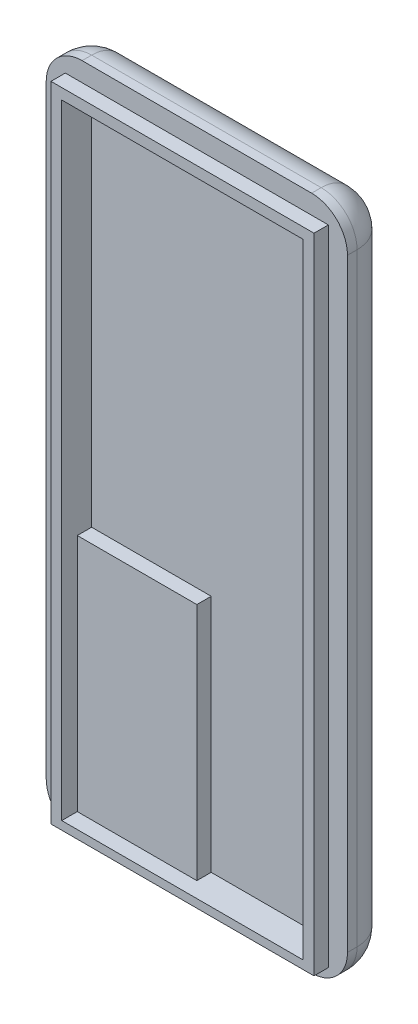
ISO-10303-21;
HEADER;
FILE_DESCRIPTION(('STEP AP214'),'2;1');
FILE_NAME('part.step','',(''),(''),'','','');
FILE_SCHEMA(('AUTOMOTIVE_DESIGN { 1 0 10303 214 1 1 1 1 }'));
ENDSEC;
DATA;
#1=APPLICATION_CONTEXT('core data for automotive mechanical design processes');
#2=APPLICATION_PROTOCOL_DEFINITION('international standard','automotive_design',2000,#1);
#3=PRODUCT_CONTEXT('',#1,'mechanical');
#4=PRODUCT('Part','Part','',(#3));
#5=PRODUCT_RELATED_PRODUCT_CATEGORY('part','',(#4));
#6=PRODUCT_DEFINITION_FORMATION('','',#4);
#7=PRODUCT_DEFINITION_CONTEXT('part definition',#1,'design');
#8=PRODUCT_DEFINITION('design','',#6,#7);
#9=PRODUCT_DEFINITION_SHAPE('','',#8);
#10=(LENGTH_UNIT() NAMED_UNIT(*) SI_UNIT(.MILLI.,.METRE.));
#11=(NAMED_UNIT(*) PLANE_ANGLE_UNIT() SI_UNIT($,.RADIAN.));
#12=(NAMED_UNIT(*) SI_UNIT($,.STERADIAN.) SOLID_ANGLE_UNIT());
#13=UNCERTAINTY_MEASURE_WITH_UNIT(LENGTH_MEASURE(1.E-05),#10,'distance_accuracy_value','');
#14=(GEOMETRIC_REPRESENTATION_CONTEXT(3) GLOBAL_UNCERTAINTY_ASSIGNED_CONTEXT((#13)) GLOBAL_UNIT_ASSIGNED_CONTEXT((#10,
#11,#12)) REPRESENTATION_CONTEXT('',''));
#15=CARTESIAN_POINT('',(0.,0.,0.));
#16=DIRECTION('',(0.,0.,1.));
#17=DIRECTION('',(1.,0.,0.));
#18=AXIS2_PLACEMENT_3D('',#15,#16,#17);
#19=CARTESIAN_POINT('',(0.,0.,2.4));
#20=DIRECTION('',(0.,0.,1.));
#21=DIRECTION('',(1.,0.,0.));
#22=AXIS2_PLACEMENT_3D('',#19,#20,#21);
#23=PLANE('',#22);
#24=DIRECTION('',(-1.,0.,0.));
#25=VECTOR('',#24,1.);
#26=CARTESIAN_POINT('',(2.4999999999995,21.8,2.4));
#27=LINE('',#26,#25);
#28=CARTESIAN_POINT('',(12.4999999999995,21.8,2.40000000000001));
#29=VERTEX_POINT('',#28);
#30=CARTESIAN_POINT('',(2.4999999999995,21.8,2.4));
#31=VERTEX_POINT('',#30);
#32=EDGE_CURVE('E220',#29,#31,#27,.T.);
#33=ORIENTED_EDGE('',*,*,#32,.F.);
#34=DIRECTION('',(0.,1.,0.));
#35=VECTOR('',#34,1.);
#36=CARTESIAN_POINT('',(12.4999999999995,1.8,2.40000000000001));
#37=LINE('',#36,#35);
#38=CARTESIAN_POINT('',(12.4999999999995,1.8,2.40000000000001));
#39=VERTEX_POINT('',#38);
#40=EDGE_CURVE('E224',#39,#29,#37,.T.);
#41=ORIENTED_EDGE('',*,*,#40,.F.);
#42=DIRECTION('',(1.,0.,0.));
#43=VECTOR('',#42,1.);
#44=CARTESIAN_POINT('',(2.49999999999961,1.8,2.4));
#45=LINE('',#44,#43);
#46=CARTESIAN_POINT('',(22.6999999999996,1.8,2.4));
#47=VERTEX_POINT('',#46);
#48=EDGE_CURVE('E270',#39,#47,#45,.T.);
#49=ORIENTED_EDGE('',*,*,#48,.T.);
#50=DIRECTION('',(0.,1.,0.));
#51=VECTOR('',#50,1.);
#52=CARTESIAN_POINT('',(22.6999999999999,54.,2.4));
#53=LINE('',#52,#51);
#54=CARTESIAN_POINT('',(22.6999999999999,54.,2.4));
#55=VERTEX_POINT('',#54);
#56=EDGE_CURVE('E273',#47,#55,#53,.T.);
#57=ORIENTED_EDGE('',*,*,#56,.T.);
#58=DIRECTION('',(-1.,0.,0.));
#59=VECTOR('',#58,1.);
#60=CARTESIAN_POINT('',(2.49999999999995,54.,2.4));
#61=LINE('',#60,#59);
#62=CARTESIAN_POINT('',(2.49999999999995,54.,2.4));
#63=VERTEX_POINT('',#62);
#64=EDGE_CURVE('E202',#55,#63,#61,.T.);
#65=ORIENTED_EDGE('',*,*,#64,.T.);
#66=DIRECTION('',(0.,-1.,0.));
#67=VECTOR('',#66,1.);
#68=CARTESIAN_POINT('',(2.49999999999995,54.,2.4));
#69=LINE('',#68,#67);
#70=EDGE_CURVE('E266',#63,#31,#69,.T.);
#71=ORIENTED_EDGE('',*,*,#70,.T.);
#72=EDGE_LOOP('',(#33,#41,#49,#57,#65,#71));
#73=FACE_BOUND('',#72,.T.);
#74=ADVANCED_FACE('F45',(#73),#23,.T.);
#75=CARTESIAN_POINT('',(2.49999999999961,1.8,2.4));
#76=DIRECTION('',(0.,-1.,0.));
#77=DIRECTION('',(0.,0.,-1.));
#78=AXIS2_PLACEMENT_3D('',#75,#76,#77);
#79=PLANE('',#78);
#80=DIRECTION('',(0.,0.,-1.));
#81=VECTOR('',#80,1.);
#82=CARTESIAN_POINT('',(12.4999999999995,1.8,3.60000000000001));
#83=LINE('',#82,#81);
#84=CARTESIAN_POINT('',(12.4999999999995,1.8,3.60000000000001));
#85=VERTEX_POINT('',#84);
#86=EDGE_CURVE('E209',#85,#39,#83,.T.);
#87=ORIENTED_EDGE('',*,*,#86,.F.);
#88=DIRECTION('',(1.,0.,0.));
#89=VECTOR('',#88,1.);
#90=CARTESIAN_POINT('',(2.4999999999995,1.8,3.6));
#91=LINE('',#90,#89);
#92=CARTESIAN_POINT('',(2.4999999999995,1.8,3.6));
#93=VERTEX_POINT('',#92);
#94=EDGE_CURVE('E205',#93,#85,#91,.T.);
#95=ORIENTED_EDGE('',*,*,#94,.F.);
#96=DIRECTION('',(0.,0.,1.));
#97=VECTOR('',#96,1.);
#98=CARTESIAN_POINT('',(2.49999999999961,1.8,2.4));
#99=LINE('',#98,#97);
#100=CARTESIAN_POINT('',(2.4999999999995,1.8,4.90000000000002));
#101=VERTEX_POINT('',#100);
#102=EDGE_CURVE('E189',#93,#101,#99,.T.);
#103=ORIENTED_EDGE('',*,*,#102,.T.);
#104=DIRECTION('',(1.,0.,0.));
#105=VECTOR('',#104,1.);
#106=CARTESIAN_POINT('',(2.4999999999995,1.8,4.90000000000002));
#107=LINE('',#106,#105);
#108=CARTESIAN_POINT('',(22.6999999999996,1.8,4.90000000000003));
#109=VERTEX_POINT('',#108);
#110=EDGE_CURVE('E338',#101,#109,#107,.T.);
#111=ORIENTED_EDGE('',*,*,#110,.T.);
#112=DIRECTION('',(0.,0.,1.));
#113=VECTOR('',#112,1.);
#114=CARTESIAN_POINT('',(22.6999999999996,1.8,2.4));
#115=LINE('',#114,#113);
#116=EDGE_CURVE('E201',#47,#109,#115,.T.);
#117=ORIENTED_EDGE('',*,*,#116,.F.);
#118=ORIENTED_EDGE('',*,*,#48,.F.);
#119=EDGE_LOOP('',(#87,#95,#103,#111,#117,#118));
#120=FACE_BOUND('',#119,.T.);
#121=ADVANCED_FACE('F206',(#120),#79,.F.);
#122=CARTESIAN_POINT('',(2.49999999999995,54.,2.4));
#123=DIRECTION('',(-1.,0.,0.));
#124=DIRECTION('',(0.,-1.,0.));
#125=AXIS2_PLACEMENT_3D('',#122,#123,#124);
#126=PLANE('',#125);
#127=DIRECTION('',(0.,0.,-1.));
#128=VECTOR('',#127,1.);
#129=CARTESIAN_POINT('',(2.49999999999995,21.8,3.6));
#130=LINE('',#129,#128);
#131=CARTESIAN_POINT('',(2.49999999999995,21.8,3.6));
#132=VERTEX_POINT('',#131);
#133=EDGE_CURVE('E231',#132,#31,#130,.T.);
#134=ORIENTED_EDGE('',*,*,#133,.T.);
#135=ORIENTED_EDGE('',*,*,#70,.F.);
#136=DIRECTION('',(0.,0.,1.));
#137=VECTOR('',#136,1.);
#138=CARTESIAN_POINT('',(2.49999999999995,54.,2.4));
#139=LINE('',#138,#137);
#140=CARTESIAN_POINT('',(2.49999999999995,54.,4.90000000000002));
#141=VERTEX_POINT('',#140);
#142=EDGE_CURVE('E280',#63,#141,#139,.T.);
#143=ORIENTED_EDGE('',*,*,#142,.T.);
#144=DIRECTION('',(0.,-1.,0.));
#145=VECTOR('',#144,1.);
#146=CARTESIAN_POINT('',(2.49999999999995,54.,4.90000000000002));
#147=LINE('',#146,#145);
#148=EDGE_CURVE('E196',#141,#101,#147,.T.);
#149=ORIENTED_EDGE('',*,*,#148,.T.);
#150=ORIENTED_EDGE('',*,*,#102,.F.);
#151=DIRECTION('',(0.,-1.,0.));
#152=VECTOR('',#151,1.);
#153=CARTESIAN_POINT('',(2.4999999999995,1.8,3.6));
#154=LINE('',#153,#152);
#155=EDGE_CURVE('E193',#132,#93,#154,.T.);
#156=ORIENTED_EDGE('',*,*,#155,.F.);
#157=EDGE_LOOP('',(#134,#135,#143,#149,#150,#156));
#158=FACE_BOUND('',#157,.T.);
#159=ADVANCED_FACE('F191',(#158),#126,.F.);
#160=CARTESIAN_POINT('',(0.,0.,5.00000000000002));
#161=DIRECTION('',(1.,0.,0.));
#162=DIRECTION('',(0.,0.,-1.));
#163=AXIS2_PLACEMENT_3D('',#160,#161,#162);
#164=PLANE('',#163);
#165=DIRECTION('',(0.,-1.,0.));
#166=VECTOR('',#165,1.);
#167=CARTESIAN_POINT('',(0.,56.5,3.7));
#168=LINE('',#167,#166);
#169=CARTESIAN_POINT('',(0.,53.5,3.7));
#170=VERTEX_POINT('',#169);
#171=CARTESIAN_POINT('',(0.,3.,3.7));
#172=VERTEX_POINT('',#171);
#173=EDGE_CURVE('E311',#170,#172,#168,.T.);
#174=ORIENTED_EDGE('',*,*,#173,.F.);
#175=DIRECTION('',(0.,0.,-1.));
#176=VECTOR('',#175,1.);
#177=CARTESIAN_POINT('',(0.,53.5,5.00000000000002));
#178=LINE('',#177,#176);
#179=CARTESIAN_POINT('',(0.,53.5,2.9));
#180=VERTEX_POINT('',#179);
#181=EDGE_CURVE('E370',#170,#180,#178,.T.);
#182=ORIENTED_EDGE('',*,*,#181,.T.);
#183=DIRECTION('',(0.,1.,0.));
#184=VECTOR('',#183,1.);
#185=CARTESIAN_POINT('',(0.,0.,2.9));
#186=LINE('',#185,#184);
#187=CARTESIAN_POINT('',(0.,3.,2.9));
#188=VERTEX_POINT('',#187);
#189=EDGE_CURVE('E367',#180,#188,#186,.F.);
#190=ORIENTED_EDGE('',*,*,#189,.T.);
#191=DIRECTION('',(0.,0.,-1.));
#192=VECTOR('',#191,1.);
#193=CARTESIAN_POINT('',(0.,3.,5.00000000000002));
#194=LINE('',#193,#192);
#195=EDGE_CURVE('E364',#188,#172,#194,.F.);
#196=ORIENTED_EDGE('',*,*,#195,.T.);
#197=EDGE_LOOP('',(#174,#182,#190,#196));
#198=FACE_BOUND('',#197,.T.);
#199=ADVANCED_FACE('F498',(#198),#164,.F.);
#200=CARTESIAN_POINT('',(0.,0.,5.00000000000002));
#201=DIRECTION('',(0.,1.,0.));
#202=DIRECTION('',(0.,0.,1.));
#203=AXIS2_PLACEMENT_3D('',#200,#201,#202);
#204=PLANE('',#203);
#205=DIRECTION('',(1.,0.,0.));
#206=VECTOR('',#205,1.);
#207=CARTESIAN_POINT('',(0.,0.,3.7));
#208=LINE('',#207,#206);
#209=CARTESIAN_POINT('',(2.99999999999956,0.,3.7));
#210=VERTEX_POINT('',#209);
#211=CARTESIAN_POINT('',(22.1999999999996,0.,3.7));
#212=VERTEX_POINT('',#211);
#213=EDGE_CURVE('E326',#210,#212,#208,.T.);
#214=ORIENTED_EDGE('',*,*,#213,.F.);
#215=DIRECTION('',(0.,0.,-1.));
#216=VECTOR('',#215,1.);
#217=CARTESIAN_POINT('',(2.99999999999956,0.,5.00000000000002));
#218=LINE('',#217,#216);
#219=CARTESIAN_POINT('',(2.99999999999956,0.,2.9));
#220=VERTEX_POINT('',#219);
#221=EDGE_CURVE('E379',#210,#220,#218,.T.);
#222=ORIENTED_EDGE('',*,*,#221,.T.);
#223=DIRECTION('',(-1.,0.,0.));
#224=VECTOR('',#223,1.);
#225=CARTESIAN_POINT('',(25.1999999999996,0.,2.9));
#226=LINE('',#225,#224);
#227=CARTESIAN_POINT('',(22.1999999999996,0.,2.9));
#228=VERTEX_POINT('',#227);
#229=EDGE_CURVE('E376',#220,#228,#226,.F.);
#230=ORIENTED_EDGE('',*,*,#229,.T.);
#231=DIRECTION('',(0.,0.,-1.));
#232=VECTOR('',#231,1.);
#233=CARTESIAN_POINT('',(22.1999999999996,0.,5.00000000000002));
#234=LINE('',#233,#232);
#235=EDGE_CURVE('E373',#228,#212,#234,.F.);
#236=ORIENTED_EDGE('',*,*,#235,.T.);
#237=EDGE_LOOP('',(#214,#222,#230,#236));
#238=FACE_BOUND('',#237,.T.);
#239=ADVANCED_FACE('F466',(#238),#204,.F.);
#240=CARTESIAN_POINT('',(25.1999999999996,0.,5.00000000000002));
#241=DIRECTION('',(-1.,0.,0.));
#242=DIRECTION('',(0.,-1.,0.));
#243=AXIS2_PLACEMENT_3D('',#240,#241,#242);
#244=PLANE('',#243);
#245=DIRECTION('',(0.,-1.,0.));
#246=VECTOR('',#245,1.);
#247=CARTESIAN_POINT('',(25.2,56.5,2.9));
#248=LINE('',#247,#246);
#249=CARTESIAN_POINT('',(25.1999999999996,3.,2.9));
#250=VERTEX_POINT('',#249);
#251=CARTESIAN_POINT('',(25.2,53.5,2.9));
#252=VERTEX_POINT('',#251);
#253=EDGE_CURVE('E63',#250,#252,#248,.F.);
#254=ORIENTED_EDGE('',*,*,#253,.T.);
#255=DIRECTION('',(0.,0.,-1.));
#256=VECTOR('',#255,1.);
#257=CARTESIAN_POINT('',(25.2,53.5,5.00000000000002));
#258=LINE('',#257,#256);
#259=CARTESIAN_POINT('',(25.2,53.5,3.7));
#260=VERTEX_POINT('',#259);
#261=EDGE_CURVE('E386',#252,#260,#258,.F.);
#262=ORIENTED_EDGE('',*,*,#261,.T.);
#263=DIRECTION('',(0.,1.,0.));
#264=VECTOR('',#263,1.);
#265=CARTESIAN_POINT('',(25.2,56.5,3.7));
#266=LINE('',#265,#264);
#267=CARTESIAN_POINT('',(25.1999999999996,3.,3.7));
#268=VERTEX_POINT('',#267);
#269=EDGE_CURVE('E330',#268,#260,#266,.T.);
#270=ORIENTED_EDGE('',*,*,#269,.F.);
#271=DIRECTION('',(0.,0.,-1.));
#272=VECTOR('',#271,1.);
#273=CARTESIAN_POINT('',(25.1999999999996,3.,5.00000000000002));
#274=LINE('',#273,#272);
#275=EDGE_CURVE('E68',#268,#250,#274,.T.);
#276=ORIENTED_EDGE('',*,*,#275,.T.);
#277=EDGE_LOOP('',(#254,#262,#270,#276));
#278=FACE_BOUND('',#277,.T.);
#279=ADVANCED_FACE('F474',(#278),#244,.F.);
#280=CARTESIAN_POINT('',(0.,56.5,5.00000000000002));
#281=DIRECTION('',(0.,-1.,0.));
#282=DIRECTION('',(0.,0.,-1.));
#283=AXIS2_PLACEMENT_3D('',#280,#281,#282);
#284=PLANE('',#283);
#285=DIRECTION('',(-1.,0.,0.));
#286=VECTOR('',#285,1.);
#287=CARTESIAN_POINT('',(0.,56.5,3.7));
#288=LINE('',#287,#286);
#289=CARTESIAN_POINT('',(22.2,56.5,3.7));
#290=VERTEX_POINT('',#289);
#291=CARTESIAN_POINT('',(3.,56.5,3.7));
#292=VERTEX_POINT('',#291);
#293=EDGE_CURVE('E334',#290,#292,#288,.T.);
#294=ORIENTED_EDGE('',*,*,#293,.F.);
#295=DIRECTION('',(0.,0.,-1.));
#296=VECTOR('',#295,1.);
#297=CARTESIAN_POINT('',(22.2,56.5,5.00000000000002));
#298=LINE('',#297,#296);
#299=CARTESIAN_POINT('',(22.2,56.5,2.9));
#300=VERTEX_POINT('',#299);
#301=EDGE_CURVE('E361',#290,#300,#298,.T.);
#302=ORIENTED_EDGE('',*,*,#301,.T.);
#303=DIRECTION('',(1.,0.,0.));
#304=VECTOR('',#303,1.);
#305=CARTESIAN_POINT('',(0.,56.5,2.9));
#306=LINE('',#305,#304);
#307=CARTESIAN_POINT('',(3.,56.5,2.9));
#308=VERTEX_POINT('',#307);
#309=EDGE_CURVE('E357',#300,#308,#306,.F.);
#310=ORIENTED_EDGE('',*,*,#309,.T.);
#311=DIRECTION('',(0.,0.,-1.));
#312=VECTOR('',#311,1.);
#313=CARTESIAN_POINT('',(3.,56.5,5.00000000000002));
#314=LINE('',#313,#312);
#315=EDGE_CURVE('E354',#308,#292,#314,.F.);
#316=ORIENTED_EDGE('',*,*,#315,.T.);
#317=EDGE_LOOP('',(#294,#302,#310,#316));
#318=FACE_BOUND('',#317,.T.);
#319=ADVANCED_FACE('F490',(#318),#284,.F.);
#320=CARTESIAN_POINT('',(0.,0.,3.7));
#321=DIRECTION('',(0.,0.,1.));
#322=DIRECTION('',(1.,0.,0.));
#323=AXIS2_PLACEMENT_3D('',#320,#321,#322);
#324=PLANE('',#323);
#325=DIRECTION('',(-1.,0.,0.));
#326=VECTOR('',#325,1.);
#327=CARTESIAN_POINT('',(1.59999999999993,54.9,3.70000000000001));
#328=LINE('',#327,#326);
#329=CARTESIAN_POINT('',(23.6,54.9,3.70000000000001));
#330=VERTEX_POINT('',#329);
#331=CARTESIAN_POINT('',(1.59999999999993,54.9,3.70000000000001));
#332=VERTEX_POINT('',#331);
#333=EDGE_CURVE('E302',#330,#332,#328,.T.);
#334=ORIENTED_EDGE('',*,*,#333,.F.);
#335=DIRECTION('',(0.,1.,0.));
#336=VECTOR('',#335,1.);
#337=CARTESIAN_POINT('',(23.6,54.9,3.70000000000001));
#338=LINE('',#337,#336);
#339=CARTESIAN_POINT('',(23.5999999999996,1.1,3.70000000000001));
#340=VERTEX_POINT('',#339);
#341=EDGE_CURVE('E298',#340,#330,#338,.T.);
#342=ORIENTED_EDGE('',*,*,#341,.F.);
#343=DIRECTION('',(1.,0.,0.));
#344=VECTOR('',#343,1.);
#345=CARTESIAN_POINT('',(1.5999999999996,1.1,3.70000000000001));
#346=LINE('',#345,#344);
#347=CARTESIAN_POINT('',(1.5999999999996,1.1,3.70000000000001));
#348=VERTEX_POINT('',#347);
#349=EDGE_CURVE('E294',#348,#340,#346,.T.);
#350=ORIENTED_EDGE('',*,*,#349,.F.);
#351=DIRECTION('',(0.,-1.,0.));
#352=VECTOR('',#351,1.);
#353=CARTESIAN_POINT('',(1.59999999999993,54.9,3.70000000000001));
#354=LINE('',#353,#352);
#355=EDGE_CURVE('E283',#332,#348,#354,.T.);
#356=ORIENTED_EDGE('',*,*,#355,.F.);
#357=EDGE_LOOP('',(#334,#342,#350,#356));
#358=FACE_BOUND('',#357,.T.);
#359=ORIENTED_EDGE('',*,*,#269,.T.);
#360=CARTESIAN_POINT('',(22.2,53.5,3.7));
#361=DIRECTION('',(0.,0.,1.));
#362=DIRECTION('',(1.,0.,0.));
#363=AXIS2_PLACEMENT_3D('',#360,#361,#362);
#364=CIRCLE('',#363,3.);
#365=EDGE_CURVE('E11',#260,#290,#364,.T.);
#366=ORIENTED_EDGE('',*,*,#365,.T.);
#367=ORIENTED_EDGE('',*,*,#293,.T.);
#368=CARTESIAN_POINT('',(3.,53.5,3.7));
#369=DIRECTION('',(0.,0.,1.));
#370=DIRECTION('',(1.,0.,0.));
#371=AXIS2_PLACEMENT_3D('',#368,#369,#370);
#372=CIRCLE('',#371,3.);
#373=EDGE_CURVE('E55',#292,#170,#372,.T.);
#374=ORIENTED_EDGE('',*,*,#373,.T.);
#375=ORIENTED_EDGE('',*,*,#173,.T.);
#376=CARTESIAN_POINT('',(2.99999999999956,3.,3.7));
#377=DIRECTION('',(0.,0.,1.));
#378=DIRECTION('',(1.,0.,0.));
#379=AXIS2_PLACEMENT_3D('',#376,#377,#378);
#380=CIRCLE('',#379,3.);
#381=EDGE_CURVE('E392',#172,#210,#380,.T.);
#382=ORIENTED_EDGE('',*,*,#381,.T.);
#383=ORIENTED_EDGE('',*,*,#213,.T.);
#384=CARTESIAN_POINT('',(22.1999999999996,3.,3.7));
#385=DIRECTION('',(0.,0.,1.));
#386=DIRECTION('',(1.,0.,0.));
#387=AXIS2_PLACEMENT_3D('',#384,#385,#386);
#388=CIRCLE('',#387,3.);
#389=EDGE_CURVE('E389',#212,#268,#388,.T.);
#390=ORIENTED_EDGE('',*,*,#389,.T.);
#391=EDGE_LOOP('',(#359,#366,#367,#374,#375,#382,#383,#390));
#392=FACE_BOUND('',#391,.T.);
#393=ADVANCED_FACE('F472',(#358,#392),#324,.T.);
#394=CARTESIAN_POINT('',(1.59999999999993,54.9,3.70000000000001));
#395=DIRECTION('',(-1.,0.,0.));
#396=DIRECTION('',(0.,-1.,0.));
#397=AXIS2_PLACEMENT_3D('',#394,#395,#396);
#398=PLANE('',#397);
#399=DIRECTION('',(0.,-1.,0.));
#400=VECTOR('',#399,1.);
#401=CARTESIAN_POINT('',(1.59999999999993,54.9,4.90000000000003));
#402=LINE('',#401,#400);
#403=CARTESIAN_POINT('',(1.59999999999993,54.9,4.90000000000003));
#404=VERTEX_POINT('',#403);
#405=CARTESIAN_POINT('',(1.5999999999996,1.1,4.90000000000003));
#406=VERTEX_POINT('',#405);
#407=EDGE_CURVE('E243',#404,#406,#402,.T.);
#408=ORIENTED_EDGE('',*,*,#407,.F.);
#409=DIRECTION('',(0.,0.,1.));
#410=VECTOR('',#409,1.);
#411=CARTESIAN_POINT('',(1.59999999999993,54.9,3.70000000000001));
#412=LINE('',#411,#410);
#413=EDGE_CURVE('E307',#332,#404,#412,.T.);
#414=ORIENTED_EDGE('',*,*,#413,.F.);
#415=ORIENTED_EDGE('',*,*,#355,.T.);
#416=DIRECTION('',(0.,0.,1.));
#417=VECTOR('',#416,1.);
#418=CARTESIAN_POINT('',(1.5999999999996,1.1,3.70000000000001));
#419=LINE('',#418,#417);
#420=EDGE_CURVE('E306',#348,#406,#419,.T.);
#421=ORIENTED_EDGE('',*,*,#420,.T.);
#422=EDGE_LOOP('',(#408,#414,#415,#421));
#423=FACE_BOUND('',#422,.T.);
#424=ADVANCED_FACE('F534',(#423),#398,.T.);
#425=CARTESIAN_POINT('',(1.59999999999993,54.9,3.70000000000001));
#426=DIRECTION('',(0.,1.,0.));
#427=DIRECTION('',(0.,0.,1.));
#428=AXIS2_PLACEMENT_3D('',#425,#426,#427);
#429=PLANE('',#428);
#430=DIRECTION('',(-1.,0.,0.));
#431=VECTOR('',#430,1.);
#432=CARTESIAN_POINT('',(25.2,54.9,4.90000000000002));
#433=LINE('',#432,#431);
#434=CARTESIAN_POINT('',(23.6,54.9,4.90000000000003));
#435=VERTEX_POINT('',#434);
#436=EDGE_CURVE('E246',#435,#404,#433,.T.);
#437=ORIENTED_EDGE('',*,*,#436,.F.);
#438=DIRECTION('',(0.,0.,1.));
#439=VECTOR('',#438,1.);
#440=CARTESIAN_POINT('',(23.6,54.9,3.70000000000001));
#441=LINE('',#440,#439);
#442=EDGE_CURVE('E312',#330,#435,#441,.T.);
#443=ORIENTED_EDGE('',*,*,#442,.F.);
#444=ORIENTED_EDGE('',*,*,#333,.T.);
#445=ORIENTED_EDGE('',*,*,#413,.T.);
#446=EDGE_LOOP('',(#437,#443,#444,#445));
#447=FACE_BOUND('',#446,.T.);
#448=ADVANCED_FACE('F530',(#447),#429,.T.);
#449=CARTESIAN_POINT('',(23.6,54.9,3.70000000000001));
#450=DIRECTION('',(1.,0.,0.));
#451=DIRECTION('',(0.,1.,0.));
#452=AXIS2_PLACEMENT_3D('',#449,#450,#451);
#453=PLANE('',#452);
#454=DIRECTION('',(0.,1.,0.));
#455=VECTOR('',#454,1.);
#456=CARTESIAN_POINT('',(23.6,54.9,4.90000000000003));
#457=LINE('',#456,#455);
#458=CARTESIAN_POINT('',(23.5999999999996,1.1,4.90000000000003));
#459=VERTEX_POINT('',#458);
#460=EDGE_CURVE('E263',#459,#435,#457,.T.);
#461=ORIENTED_EDGE('',*,*,#460,.F.);
#462=DIRECTION('',(0.,0.,1.));
#463=VECTOR('',#462,1.);
#464=CARTESIAN_POINT('',(23.5999999999996,1.1,3.70000000000001));
#465=LINE('',#464,#463);
#466=EDGE_CURVE('E316',#340,#459,#465,.T.);
#467=ORIENTED_EDGE('',*,*,#466,.F.);
#468=ORIENTED_EDGE('',*,*,#341,.T.);
#469=ORIENTED_EDGE('',*,*,#442,.T.);
#470=EDGE_LOOP('',(#461,#467,#468,#469));
#471=FACE_BOUND('',#470,.T.);
#472=ADVANCED_FACE('F533',(#471),#453,.T.);
#473=CARTESIAN_POINT('',(1.5999999999996,1.1,3.70000000000001));
#474=DIRECTION('',(0.,-1.,0.));
#475=DIRECTION('',(0.,0.,-1.));
#476=AXIS2_PLACEMENT_3D('',#473,#474,#475);
#477=PLANE('',#476);
#478=DIRECTION('',(-1.,0.,0.));
#479=VECTOR('',#478,1.);
#480=CARTESIAN_POINT('',(25.1999999999996,1.1,4.90000000000002));
#481=LINE('',#480,#479);
#482=EDGE_CURVE('E247',#459,#406,#481,.T.);
#483=ORIENTED_EDGE('',*,*,#482,.T.);
#484=ORIENTED_EDGE('',*,*,#420,.F.);
#485=ORIENTED_EDGE('',*,*,#349,.T.);
#486=ORIENTED_EDGE('',*,*,#466,.T.);
#487=EDGE_LOOP('',(#483,#484,#485,#486));
#488=FACE_BOUND('',#487,.T.);
#489=ADVANCED_FACE('F538',(#488),#477,.T.);
#490=CARTESIAN_POINT('',(25.2,54.9,4.90000000000002));
#491=DIRECTION('',(0.,0.,-1.));
#492=DIRECTION('',(0.,1.,0.));
#493=AXIS2_PLACEMENT_3D('',#490,#491,#492);
#494=PLANE('',#493);
#495=ORIENTED_EDGE('',*,*,#460,.T.);
#496=ORIENTED_EDGE('',*,*,#436,.T.);
#497=ORIENTED_EDGE('',*,*,#407,.T.);
#498=ORIENTED_EDGE('',*,*,#482,.F.);
#499=EDGE_LOOP('',(#495,#496,#497,#498));
#500=FACE_BOUND('',#499,.T.);
#501=DIRECTION('',(-1.,0.,0.));
#502=VECTOR('',#501,1.);
#503=CARTESIAN_POINT('',(2.49999999999995,54.,4.90000000000002));
#504=LINE('',#503,#502);
#505=CARTESIAN_POINT('',(22.6999999999999,54.,4.90000000000002));
#506=VERTEX_POINT('',#505);
#507=EDGE_CURVE('E257',#506,#141,#504,.T.);
#508=ORIENTED_EDGE('',*,*,#507,.F.);
#509=DIRECTION('',(0.,1.,0.));
#510=VECTOR('',#509,1.);
#511=CARTESIAN_POINT('',(22.6999999999999,54.,4.90000000000002));
#512=LINE('',#511,#510);
#513=EDGE_CURVE('E251',#109,#506,#512,.T.);
#514=ORIENTED_EDGE('',*,*,#513,.F.);
#515=ORIENTED_EDGE('',*,*,#110,.F.);
#516=ORIENTED_EDGE('',*,*,#148,.F.);
#517=EDGE_LOOP('',(#508,#514,#515,#516));
#518=FACE_BOUND('',#517,.T.);
#519=ADVANCED_FACE('F518',(#500,#518),#494,.F.);
#520=CARTESIAN_POINT('',(22.6999999999999,54.,2.4));
#521=DIRECTION('',(1.,0.,0.));
#522=DIRECTION('',(0.,1.,0.));
#523=AXIS2_PLACEMENT_3D('',#520,#521,#522);
#524=PLANE('',#523);
#525=ORIENTED_EDGE('',*,*,#116,.T.);
#526=ORIENTED_EDGE('',*,*,#513,.T.);
#527=DIRECTION('',(0.,0.,1.));
#528=VECTOR('',#527,1.);
#529=CARTESIAN_POINT('',(22.6999999999999,54.,2.4));
#530=LINE('',#529,#528);
#531=EDGE_CURVE('E284',#55,#506,#530,.T.);
#532=ORIENTED_EDGE('',*,*,#531,.F.);
#533=ORIENTED_EDGE('',*,*,#56,.F.);
#534=EDGE_LOOP('',(#525,#526,#532,#533));
#535=FACE_BOUND('',#534,.T.);
#536=ADVANCED_FACE('F523',(#535),#524,.F.);
#537=CARTESIAN_POINT('',(2.49999999999995,54.,2.4));
#538=DIRECTION('',(0.,1.,0.));
#539=DIRECTION('',(0.,0.,1.));
#540=AXIS2_PLACEMENT_3D('',#537,#538,#539);
#541=PLANE('',#540);
#542=ORIENTED_EDGE('',*,*,#531,.T.);
#543=ORIENTED_EDGE('',*,*,#507,.T.);
#544=ORIENTED_EDGE('',*,*,#142,.F.);
#545=ORIENTED_EDGE('',*,*,#64,.F.);
#546=EDGE_LOOP('',(#542,#543,#544,#545));
#547=FACE_BOUND('',#546,.T.);
#548=ADVANCED_FACE('F520',(#547),#541,.F.);
#549=CARTESIAN_POINT('',(0.,0.,-0.0999999999999994));
#550=DIRECTION('',(0.,0.,-1.));
#551=DIRECTION('',(-1.,0.,0.));
#552=AXIS2_PLACEMENT_3D('',#549,#550,#551);
#553=PLANE('',#552);
#554=DIRECTION('',(0.,1.,0.));
#555=VECTOR('',#554,1.);
#556=CARTESIAN_POINT('',(3.,56.5,-0.0999999999999994));
#557=LINE('',#556,#555);
#558=CARTESIAN_POINT('',(2.99999999999956,3.,-0.0999999999999994));
#559=VERTEX_POINT('',#558);
#560=CARTESIAN_POINT('',(3.,53.5,-0.0999999999999994));
#561=VERTEX_POINT('',#560);
#562=EDGE_CURVE('E347',#559,#561,#557,.T.);
#563=ORIENTED_EDGE('',*,*,#562,.T.);
#564=DIRECTION('',(1.,0.,0.));
#565=VECTOR('',#564,1.);
#566=CARTESIAN_POINT('',(25.2,53.5,-0.0999999999999994));
#567=LINE('',#566,#565);
#568=CARTESIAN_POINT('',(22.2,53.5,-0.0999999999999994));
#569=VERTEX_POINT('',#568);
#570=EDGE_CURVE('E350',#561,#569,#567,.T.);
#571=ORIENTED_EDGE('',*,*,#570,.T.);
#572=DIRECTION('',(0.,-1.,0.));
#573=VECTOR('',#572,1.);
#574=CARTESIAN_POINT('',(22.1999999999996,0.,-0.0999999999999994));
#575=LINE('',#574,#573);
#576=CARTESIAN_POINT('',(22.1999999999996,3.,-0.0999999999999994));
#577=VERTEX_POINT('',#576);
#578=EDGE_CURVE('E341',#569,#577,#575,.T.);
#579=ORIENTED_EDGE('',*,*,#578,.T.);
#580=DIRECTION('',(-1.,0.,0.));
#581=VECTOR('',#580,1.);
#582=CARTESIAN_POINT('',(0.,3.,-0.0999999999999994));
#583=LINE('',#582,#581);
#584=EDGE_CURVE('E344',#577,#559,#583,.T.);
#585=ORIENTED_EDGE('',*,*,#584,.T.);
#586=EDGE_LOOP('',(#563,#571,#579,#585));
#587=FACE_BOUND('',#586,.T.);
#588=ADVANCED_FACE('F455',(#587),#553,.T.);
#589=CARTESIAN_POINT('',(12.4999999999995,1.8,3.60000000000001));
#590=DIRECTION('',(-1.,0.,0.));
#591=DIRECTION('',(0.,0.,1.));
#592=AXIS2_PLACEMENT_3D('',#589,#590,#591);
#593=PLANE('',#592);
#594=ORIENTED_EDGE('',*,*,#40,.T.);
#595=DIRECTION('',(0.,0.,-1.));
#596=VECTOR('',#595,1.);
#597=CARTESIAN_POINT('',(12.5,21.8,3.60000000000001));
#598=LINE('',#597,#596);
#599=CARTESIAN_POINT('',(12.5,21.8,3.60000000000001));
#600=VERTEX_POINT('',#599);
#601=EDGE_CURVE('E237',#600,#29,#598,.T.);
#602=ORIENTED_EDGE('',*,*,#601,.F.);
#603=DIRECTION('',(0.,1.,0.));
#604=VECTOR('',#603,1.);
#605=CARTESIAN_POINT('',(12.4999999999995,1.8,3.60000000000001));
#606=LINE('',#605,#604);
#607=EDGE_CURVE('E213',#85,#600,#606,.T.);
#608=ORIENTED_EDGE('',*,*,#607,.F.);
#609=ORIENTED_EDGE('',*,*,#86,.T.);
#610=EDGE_LOOP('',(#594,#602,#608,#609));
#611=FACE_BOUND('',#610,.T.);
#612=ADVANCED_FACE('F632',(#611),#593,.F.);
#613=CARTESIAN_POINT('',(2.49999999999995,21.8,3.6));
#614=DIRECTION('',(0.,-1.,0.));
#615=DIRECTION('',(0.,0.,-1.));
#616=AXIS2_PLACEMENT_3D('',#613,#614,#615);
#617=PLANE('',#616);
#618=ORIENTED_EDGE('',*,*,#32,.T.);
#619=ORIENTED_EDGE('',*,*,#133,.F.);
#620=DIRECTION('',(-1.,0.,0.));
#621=VECTOR('',#620,1.);
#622=CARTESIAN_POINT('',(2.49999999999995,21.8,3.6));
#623=LINE('',#622,#621);
#624=EDGE_CURVE('E217',#600,#132,#623,.T.);
#625=ORIENTED_EDGE('',*,*,#624,.F.);
#626=ORIENTED_EDGE('',*,*,#601,.T.);
#627=EDGE_LOOP('',(#618,#619,#625,#626));
#628=FACE_BOUND('',#627,.T.);
#629=ADVANCED_FACE('F506',(#628),#617,.F.);
#630=CARTESIAN_POINT('',(0.,0.,3.6));
#631=DIRECTION('',(0.,0.,-1.));
#632=DIRECTION('',(-1.,0.,0.));
#633=AXIS2_PLACEMENT_3D('',#630,#631,#632);
#634=PLANE('',#633);
#635=ORIENTED_EDGE('',*,*,#155,.T.);
#636=ORIENTED_EDGE('',*,*,#94,.T.);
#637=ORIENTED_EDGE('',*,*,#607,.T.);
#638=ORIENTED_EDGE('',*,*,#624,.T.);
#639=EDGE_LOOP('',(#635,#636,#637,#638));
#640=FACE_BOUND('',#639,.T.);
#641=ADVANCED_FACE('F215',(#640),#634,.F.);
#642=CARTESIAN_POINT('',(2.99999999999956,3.,5.00000000000002));
#643=DIRECTION('',(0.,0.,-1.));
#644=DIRECTION('',(-1.,0.,0.));
#645=AXIS2_PLACEMENT_3D('',#642,#643,#644);
#646=CYLINDRICAL_SURFACE('',#645,3.);
#647=ORIENTED_EDGE('',*,*,#381,.F.);
#648=ORIENTED_EDGE('',*,*,#195,.F.);
#649=CARTESIAN_POINT('',(2.99999999999956,3.,2.9));
#650=DIRECTION('',(0.,0.,-1.));
#651=DIRECTION('',(-1.,0.,0.));
#652=AXIS2_PLACEMENT_3D('',#649,#650,#651);
#653=CIRCLE('',#652,3.);
#654=EDGE_CURVE('E49',#220,#188,#653,.T.);
#655=ORIENTED_EDGE('',*,*,#654,.F.);
#656=ORIENTED_EDGE('',*,*,#221,.F.);
#657=EDGE_LOOP('',(#647,#648,#655,#656));
#658=FACE_BOUND('',#657,.T.);
#659=ADVANCED_FACE('F47',(#658),#646,.T.);
#660=CARTESIAN_POINT('',(0.,3.,2.9));
#661=DIRECTION('',(1.,0.,0.));
#662=DIRECTION('',(0.,0.,-1.));
#663=AXIS2_PLACEMENT_3D('',#660,#661,#662);
#664=CYLINDRICAL_SURFACE('',#663,3.);
#665=CARTESIAN_POINT('',(22.1999999999996,3.,2.9));
#666=DIRECTION('',(1.,0.,0.));
#667=DIRECTION('',(0.,0.,-1.));
#668=AXIS2_PLACEMENT_3D('',#665,#666,#667);
#669=CIRCLE('',#668,3.);
#670=EDGE_CURVE('E431',#228,#577,#669,.T.);
#671=ORIENTED_EDGE('',*,*,#670,.F.);
#672=ORIENTED_EDGE('',*,*,#229,.F.);
#673=CARTESIAN_POINT('',(2.99999999999956,3.,2.9));
#674=DIRECTION('',(-1.,0.,0.));
#675=DIRECTION('',(0.,0.,1.));
#676=AXIS2_PLACEMENT_3D('',#673,#674,#675);
#677=CIRCLE('',#676,3.);
#678=EDGE_CURVE('E434',#559,#220,#677,.T.);
#679=ORIENTED_EDGE('',*,*,#678,.F.);
#680=ORIENTED_EDGE('',*,*,#584,.F.);
#681=EDGE_LOOP('',(#671,#672,#679,#680));
#682=FACE_BOUND('',#681,.T.);
#683=ADVANCED_FACE('F462',(#682),#664,.T.);
#684=CARTESIAN_POINT('',(22.1999999999996,3.,5.00000000000002));
#685=DIRECTION('',(0.,0.,-1.));
#686=DIRECTION('',(-1.,0.,0.));
#687=AXIS2_PLACEMENT_3D('',#684,#685,#686);
#688=CYLINDRICAL_SURFACE('',#687,3.);
#689=ORIENTED_EDGE('',*,*,#389,.F.);
#690=ORIENTED_EDGE('',*,*,#235,.F.);
#691=CARTESIAN_POINT('',(22.1999999999996,3.,2.9));
#692=DIRECTION('',(0.,0.,-1.));
#693=DIRECTION('',(-1.,0.,0.));
#694=AXIS2_PLACEMENT_3D('',#691,#692,#693);
#695=CIRCLE('',#694,3.);
#696=EDGE_CURVE('E427',#250,#228,#695,.T.);
#697=ORIENTED_EDGE('',*,*,#696,.F.);
#698=ORIENTED_EDGE('',*,*,#275,.F.);
#699=EDGE_LOOP('',(#689,#690,#697,#698));
#700=FACE_BOUND('',#699,.T.);
#701=ADVANCED_FACE('F469',(#700),#688,.T.);
#702=CARTESIAN_POINT('',(2.99999999999956,3.,2.9));
#703=DIRECTION('',(0.,-1.,0.));
#704=DIRECTION('',(0.,0.,-1.));
#705=AXIS2_PLACEMENT_3D('',#702,#703,#704);
#706=SPHERICAL_SURFACE('',#705,3.);
#707=ORIENTED_EDGE('',*,*,#678,.T.);
#708=ORIENTED_EDGE('',*,*,#654,.T.);
#709=CARTESIAN_POINT('',(2.99999999999956,3.,2.9));
#710=DIRECTION('',(0.,-1.,0.));
#711=DIRECTION('',(0.,0.,-1.));
#712=AXIS2_PLACEMENT_3D('',#709,#710,#711);
#713=CIRCLE('',#712,3.);
#714=EDGE_CURVE('E423',#559,#188,#713,.F.);
#715=ORIENTED_EDGE('',*,*,#714,.F.);
#716=EDGE_LOOP('',(#707,#708,#715));
#717=FACE_BOUND('',#716,.T.);
#718=ADVANCED_FACE('F443',(#717),#706,.T.);
#719=CARTESIAN_POINT('',(22.1999999999996,3.,2.9));
#720=DIRECTION('',(0.,-1.,0.));
#721=DIRECTION('',(0.,0.,-1.));
#722=AXIS2_PLACEMENT_3D('',#719,#720,#721);
#723=SPHERICAL_SURFACE('',#722,3.);
#724=ORIENTED_EDGE('',*,*,#696,.T.);
#725=ORIENTED_EDGE('',*,*,#670,.T.);
#726=CARTESIAN_POINT('',(22.1999999999996,3.,2.9));
#727=DIRECTION('',(0.,-1.,0.));
#728=DIRECTION('',(1.,0.,0.));
#729=AXIS2_PLACEMENT_3D('',#726,#727,#728);
#730=CIRCLE('',#729,3.);
#731=EDGE_CURVE('E419',#250,#577,#730,.F.);
#732=ORIENTED_EDGE('',*,*,#731,.F.);
#733=EDGE_LOOP('',(#724,#725,#732));
#734=FACE_BOUND('',#733,.T.);
#735=ADVANCED_FACE('F573',(#734),#723,.T.);
#736=CARTESIAN_POINT('',(3.,53.5,5.00000000000002));
#737=DIRECTION('',(0.,0.,-1.));
#738=DIRECTION('',(-1.,0.,0.));
#739=AXIS2_PLACEMENT_3D('',#736,#737,#738);
#740=CYLINDRICAL_SURFACE('',#739,3.);
#741=ORIENTED_EDGE('',*,*,#373,.F.);
#742=ORIENTED_EDGE('',*,*,#315,.F.);
#743=CARTESIAN_POINT('',(3.,53.5,2.9));
#744=DIRECTION('',(0.,0.,-1.));
#745=DIRECTION('',(-1.,0.,0.));
#746=AXIS2_PLACEMENT_3D('',#743,#744,#745);
#747=CIRCLE('',#746,3.);
#748=EDGE_CURVE('E415',#180,#308,#747,.T.);
#749=ORIENTED_EDGE('',*,*,#748,.F.);
#750=ORIENTED_EDGE('',*,*,#181,.F.);
#751=EDGE_LOOP('',(#741,#742,#749,#750));
#752=FACE_BOUND('',#751,.T.);
#753=ADVANCED_FACE('F496',(#752),#740,.T.);
#754=CARTESIAN_POINT('',(2.99999999999956,0.,2.9));
#755=DIRECTION('',(0.,-1.,0.));
#756=DIRECTION('',(0.,0.,-1.));
#757=AXIS2_PLACEMENT_3D('',#754,#755,#756);
#758=CYLINDRICAL_SURFACE('',#757,3.);
#759=ORIENTED_EDGE('',*,*,#714,.T.);
#760=ORIENTED_EDGE('',*,*,#189,.F.);
#761=CARTESIAN_POINT('',(3.,53.5,2.9));
#762=DIRECTION('',(0.,1.,0.));
#763=DIRECTION('',(0.,0.,1.));
#764=AXIS2_PLACEMENT_3D('',#761,#762,#763);
#765=CIRCLE('',#764,3.);
#766=EDGE_CURVE('E411',#561,#180,#765,.T.);
#767=ORIENTED_EDGE('',*,*,#766,.F.);
#768=ORIENTED_EDGE('',*,*,#562,.F.);
#769=EDGE_LOOP('',(#759,#760,#767,#768));
#770=FACE_BOUND('',#769,.T.);
#771=ADVANCED_FACE('F450',(#770),#758,.T.);
#772=CARTESIAN_POINT('',(22.1999999999996,0.,2.9));
#773=DIRECTION('',(0.,1.,0.));
#774=DIRECTION('',(-1.,0.,0.));
#775=AXIS2_PLACEMENT_3D('',#772,#773,#774);
#776=CYLINDRICAL_SURFACE('',#775,3.);
#777=ORIENTED_EDGE('',*,*,#731,.T.);
#778=ORIENTED_EDGE('',*,*,#578,.F.);
#779=CARTESIAN_POINT('',(22.2,53.5,2.9));
#780=DIRECTION('',(0.,1.,0.));
#781=DIRECTION('',(0.,0.,1.));
#782=AXIS2_PLACEMENT_3D('',#779,#780,#781);
#783=CIRCLE('',#782,3.);
#784=EDGE_CURVE('E407',#252,#569,#783,.T.);
#785=ORIENTED_EDGE('',*,*,#784,.F.);
#786=ORIENTED_EDGE('',*,*,#253,.F.);
#787=EDGE_LOOP('',(#777,#778,#785,#786));
#788=FACE_BOUND('',#787,.T.);
#789=ADVANCED_FACE('F482',(#788),#776,.T.);
#790=CARTESIAN_POINT('',(22.2,53.5,5.00000000000002));
#791=DIRECTION('',(0.,0.,-1.));
#792=DIRECTION('',(-1.,0.,0.));
#793=AXIS2_PLACEMENT_3D('',#790,#791,#792);
#794=CYLINDRICAL_SURFACE('',#793,3.);
#795=ORIENTED_EDGE('',*,*,#365,.F.);
#796=ORIENTED_EDGE('',*,*,#261,.F.);
#797=CARTESIAN_POINT('',(22.2,53.5,2.9));
#798=DIRECTION('',(0.,0.,-1.));
#799=DIRECTION('',(-1.,0.,0.));
#800=AXIS2_PLACEMENT_3D('',#797,#798,#799);
#801=CIRCLE('',#800,3.);
#802=EDGE_CURVE('E403',#300,#252,#801,.T.);
#803=ORIENTED_EDGE('',*,*,#802,.F.);
#804=ORIENTED_EDGE('',*,*,#301,.F.);
#805=EDGE_LOOP('',(#795,#796,#803,#804));
#806=FACE_BOUND('',#805,.T.);
#807=ADVANCED_FACE('F478',(#806),#794,.T.);
#808=CARTESIAN_POINT('',(3.,53.5,2.9));
#809=DIRECTION('',(-1.,0.,0.));
#810=DIRECTION('',(0.,0.,1.));
#811=AXIS2_PLACEMENT_3D('',#808,#809,#810);
#812=SPHERICAL_SURFACE('',#811,3.);
#813=ORIENTED_EDGE('',*,*,#766,.T.);
#814=ORIENTED_EDGE('',*,*,#748,.T.);
#815=CARTESIAN_POINT('',(3.,53.5,2.9));
#816=DIRECTION('',(-1.,0.,0.));
#817=DIRECTION('',(0.,0.,1.));
#818=AXIS2_PLACEMENT_3D('',#815,#816,#817);
#819=CIRCLE('',#818,3.);
#820=EDGE_CURVE('E400',#561,#308,#819,.F.);
#821=ORIENTED_EDGE('',*,*,#820,.F.);
#822=EDGE_LOOP('',(#813,#814,#821));
#823=FACE_BOUND('',#822,.T.);
#824=ADVANCED_FACE('F561',(#823),#812,.T.);
#825=CARTESIAN_POINT('',(22.2,53.5,2.9));
#826=DIRECTION('',(1.,0.,0.));
#827=DIRECTION('',(0.,0.,-1.));
#828=AXIS2_PLACEMENT_3D('',#825,#826,#827);
#829=SPHERICAL_SURFACE('',#828,3.);
#830=ORIENTED_EDGE('',*,*,#802,.T.);
#831=ORIENTED_EDGE('',*,*,#784,.T.);
#832=CARTESIAN_POINT('',(22.2,53.5,2.9));
#833=DIRECTION('',(1.,0.,0.));
#834=DIRECTION('',(0.,0.,-1.));
#835=AXIS2_PLACEMENT_3D('',#832,#833,#834);
#836=CIRCLE('',#835,3.);
#837=EDGE_CURVE('E397',#300,#569,#836,.F.);
#838=ORIENTED_EDGE('',*,*,#837,.F.);
#839=EDGE_LOOP('',(#830,#831,#838));
#840=FACE_BOUND('',#839,.T.);
#841=ADVANCED_FACE('F485',(#840),#829,.T.);
#842=CARTESIAN_POINT('',(0.,53.5,2.9));
#843=DIRECTION('',(-1.,0.,0.));
#844=DIRECTION('',(0.,0.,1.));
#845=AXIS2_PLACEMENT_3D('',#842,#843,#844);
#846=CYLINDRICAL_SURFACE('',#845,3.);
#847=ORIENTED_EDGE('',*,*,#820,.T.);
#848=ORIENTED_EDGE('',*,*,#309,.F.);
#849=ORIENTED_EDGE('',*,*,#837,.T.);
#850=ORIENTED_EDGE('',*,*,#570,.F.);
#851=EDGE_LOOP('',(#847,#848,#849,#850));
#852=FACE_BOUND('',#851,.T.);
#853=ADVANCED_FACE('F487',(#852),#846,.T.);
#854=CLOSED_SHELL('',(#74,#121,#159,#199,#239,#279,#319,#393,#424,#448,#472,#489,#519,#536,#548,
#588,#612,#629,#641,#659,#683,#701,#718,#735,#753,#771,#789,#807,#824,#841,#853));
#855=MANIFOLD_SOLID_BREP('B2',#854);
#856=ADVANCED_BREP_SHAPE_REPRESENTATION('',(#18,#855),#14);
#857=SHAPE_DEFINITION_REPRESENTATION(#9,#856);
ENDSEC;
END-ISO-10303-21;
